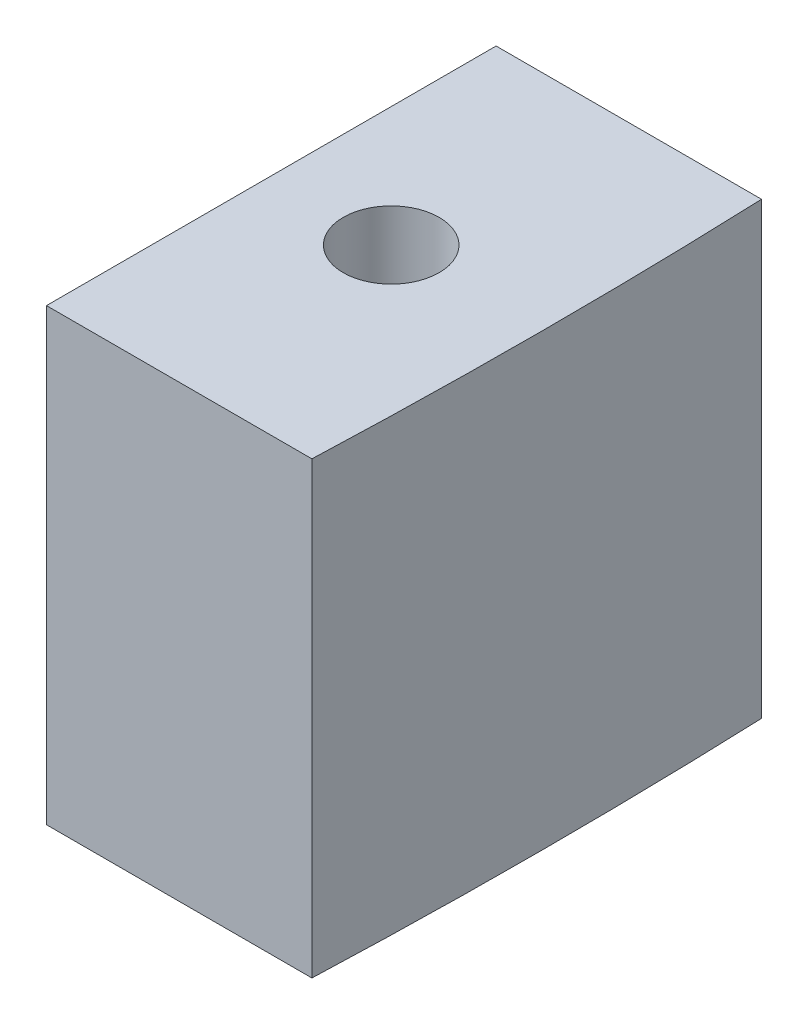
ISO-10303-21;
HEADER;
FILE_DESCRIPTION(('STEP AP214'),'2;1');
FILE_NAME('part.step','',(''),(''),'','','');
FILE_SCHEMA(('AUTOMOTIVE_DESIGN { 1 0 10303 214 1 1 1 1 }'));
ENDSEC;
DATA;
#1=APPLICATION_CONTEXT('core data for automotive mechanical design processes');
#2=APPLICATION_PROTOCOL_DEFINITION('international standard','automotive_design',2000,#1);
#3=PRODUCT_CONTEXT('',#1,'mechanical');
#4=PRODUCT('Part','Part','',(#3));
#5=PRODUCT_RELATED_PRODUCT_CATEGORY('part','',(#4));
#6=PRODUCT_DEFINITION_FORMATION('','',#4);
#7=PRODUCT_DEFINITION_CONTEXT('part definition',#1,'design');
#8=PRODUCT_DEFINITION('design','',#6,#7);
#9=PRODUCT_DEFINITION_SHAPE('','',#8);
#10=(LENGTH_UNIT() NAMED_UNIT(*) SI_UNIT(.MILLI.,.METRE.));
#11=(NAMED_UNIT(*) PLANE_ANGLE_UNIT() SI_UNIT($,.RADIAN.));
#12=(NAMED_UNIT(*) SI_UNIT($,.STERADIAN.) SOLID_ANGLE_UNIT());
#13=UNCERTAINTY_MEASURE_WITH_UNIT(LENGTH_MEASURE(1.E-05),#10,'distance_accuracy_value','');
#14=(GEOMETRIC_REPRESENTATION_CONTEXT(3) GLOBAL_UNCERTAINTY_ASSIGNED_CONTEXT((#13)) GLOBAL_UNIT_ASSIGNED_CONTEXT((#10,
#11,#12)) REPRESENTATION_CONTEXT('',''));
#15=CARTESIAN_POINT('',(0.,0.,0.));
#16=DIRECTION('',(0.,0.,1.));
#17=DIRECTION('',(1.,0.,0.));
#18=AXIS2_PLACEMENT_3D('',#15,#16,#17);
#19=CARTESIAN_POINT('',(-29.4485422847458,0.,0.));
#20=DIRECTION('',(0.,-1.,0.));
#21=DIRECTION('',(0.,0.,-1.));
#22=AXIS2_PLACEMENT_3D('',#19,#20,#21);
#23=CYLINDRICAL_SURFACE('',#22,1.59999999999999);
#24=CARTESIAN_POINT('',(-29.4485422847458,15.,0.));
#25=DIRECTION('',(0.,1.,0.));
#26=DIRECTION('',(0.,0.,1.));
#27=AXIS2_PLACEMENT_3D('',#24,#25,#26);
#28=CIRCLE('',#27,1.59999999999999);
#29=CARTESIAN_POINT('',(-29.4485422847458,15.,1.59999999999999));
#30=VERTEX_POINT('',#29);
#31=EDGE_CURVE('E166',#30,#30,#28,.T.);
#32=ORIENTED_EDGE('',*,*,#31,.T.);
#33=EDGE_LOOP('',(#32));
#34=FACE_BOUND('',#33,.T.);
#35=CARTESIAN_POINT('',(-29.4485422847458,4.,0.));
#36=DIRECTION('',(0.,-1.,0.));
#37=DIRECTION('',(0.,0.,-1.));
#38=AXIS2_PLACEMENT_3D('',#35,#36,#37);
#39=CIRCLE('',#38,1.59999999999999);
#40=CARTESIAN_POINT('',(-29.4485422847458,4.,-1.59999999999999));
#41=VERTEX_POINT('',#40);
#42=EDGE_CURVE('E37',#41,#41,#39,.F.);
#43=ORIENTED_EDGE('',*,*,#42,.F.);
#44=EDGE_LOOP('',(#43));
#45=FACE_BOUND('',#44,.T.);
#46=ADVANCED_FACE('F33',(#34,#45),#23,.F.);
#47=CARTESIAN_POINT('',(0.,0.,0.));
#48=DIRECTION('',(0.,1.,0.));
#49=DIRECTION('',(0.,0.,1.));
#50=AXIS2_PLACEMENT_3D('',#47,#48,#49);
#51=PLANE('',#50);
#52=DIRECTION('',(0.866025403784439,0.,0.5));
#53=VECTOR('',#52,1.);
#54=CARTESIAN_POINT('',(-29.4485422847458,0.,-3.2331615074619));
#55=LINE('',#54,#53);
#56=CARTESIAN_POINT('',(-29.4485422847458,0.,-3.2331615074619));
#57=VERTEX_POINT('',#56);
#58=CARTESIAN_POINT('',(-26.6485422847458,0.,-1.61658075373095));
#59=VERTEX_POINT('',#58);
#60=EDGE_CURVE('E147',#57,#59,#55,.T.);
#61=ORIENTED_EDGE('',*,*,#60,.F.);
#62=DIRECTION('',(0.866025403784439,0.,-0.5));
#63=VECTOR('',#62,1.);
#64=CARTESIAN_POINT('',(-32.2485422847457,0.,-1.61658075373095));
#65=LINE('',#64,#63);
#66=CARTESIAN_POINT('',(-32.2485422847457,0.,-1.61658075373095));
#67=VERTEX_POINT('',#66);
#68=EDGE_CURVE('E49',#67,#57,#65,.T.);
#69=ORIENTED_EDGE('',*,*,#68,.F.);
#70=DIRECTION('',(0.,0.,-1.));
#71=VECTOR('',#70,1.);
#72=CARTESIAN_POINT('',(-32.2485422847457,0.,1.61658075373095));
#73=LINE('',#72,#71);
#74=CARTESIAN_POINT('',(-32.2485422847457,0.,1.61658075373095));
#75=VERTEX_POINT('',#74);
#76=EDGE_CURVE('E133',#75,#67,#73,.T.);
#77=ORIENTED_EDGE('',*,*,#76,.F.);
#78=DIRECTION('',(-0.866025403784439,0.,-0.5));
#79=VECTOR('',#78,1.);
#80=CARTESIAN_POINT('',(-29.4485422847458,0.,3.23316150746189));
#81=LINE('',#80,#79);
#82=CARTESIAN_POINT('',(-29.4485422847458,0.,3.23316150746189));
#83=VERTEX_POINT('',#82);
#84=EDGE_CURVE('E136',#83,#75,#81,.T.);
#85=ORIENTED_EDGE('',*,*,#84,.F.);
#86=DIRECTION('',(-0.866025403784438,0.,0.5));
#87=VECTOR('',#86,1.);
#88=CARTESIAN_POINT('',(-26.6485422847458,0.,1.61658075373095));
#89=LINE('',#88,#87);
#90=CARTESIAN_POINT('',(-26.6485422847458,0.,1.61658075373095));
#91=VERTEX_POINT('',#90);
#92=EDGE_CURVE('E152',#91,#83,#89,.T.);
#93=ORIENTED_EDGE('',*,*,#92,.F.);
#94=DIRECTION('',(0.,0.,1.));
#95=VECTOR('',#94,1.);
#96=CARTESIAN_POINT('',(-26.6485422847458,0.,-1.61658075373095));
#97=LINE('',#96,#95);
#98=EDGE_CURVE('E149',#59,#91,#97,.T.);
#99=ORIENTED_EDGE('',*,*,#98,.F.);
#100=EDGE_LOOP('',(#61,#69,#77,#85,#93,#99));
#101=FACE_BOUND('',#100,.T.);
#102=DIRECTION('',(-1.,0.,0.));
#103=VECTOR('',#102,1.);
#104=CARTESIAN_POINT('',(-33.4485422847458,0.,-7.5));
#105=LINE('',#104,#103);
#106=CARTESIAN_POINT('',(-24.5935707209501,0.,-7.5));
#107=VERTEX_POINT('',#106);
#108=CARTESIAN_POINT('',(-33.4485422847458,0.,-7.5));
#109=VERTEX_POINT('',#108);
#110=EDGE_CURVE('E176',#107,#109,#105,.T.);
#111=ORIENTED_EDGE('',*,*,#110,.F.);
#112=CARTESIAN_POINT('',(-218.448542284746,0.,0.));
#113=DIRECTION('',(0.,1.,0.));
#114=DIRECTION('',(0.,0.,-1.));
#115=AXIS2_PLACEMENT_3D('',#112,#113,#114);
#116=CIRCLE('',#115,194.);
#117=CARTESIAN_POINT('',(-24.5935707209501,0.,7.5));
#118=VERTEX_POINT('',#117);
#119=EDGE_CURVE('E172',#118,#107,#116,.T.);
#120=ORIENTED_EDGE('',*,*,#119,.F.);
#121=DIRECTION('',(1.,0.,0.));
#122=VECTOR('',#121,1.);
#123=CARTESIAN_POINT('',(-33.4485422847458,0.,7.5));
#124=LINE('',#123,#122);
#125=CARTESIAN_POINT('',(-33.4485422847458,0.,7.5));
#126=VERTEX_POINT('',#125);
#127=EDGE_CURVE('E182',#126,#118,#124,.T.);
#128=ORIENTED_EDGE('',*,*,#127,.F.);
#129=DIRECTION('',(0.,0.,1.));
#130=VECTOR('',#129,1.);
#131=CARTESIAN_POINT('',(-33.4485422847458,0.,-7.5));
#132=LINE('',#131,#130);
#133=EDGE_CURVE('E188',#109,#126,#132,.T.);
#134=ORIENTED_EDGE('',*,*,#133,.F.);
#135=EDGE_LOOP('',(#111,#120,#128,#134));
#136=FACE_BOUND('',#135,.T.);
#137=ADVANCED_FACE('F203',(#101,#136),#51,.F.);
#138=CARTESIAN_POINT('',(-33.4485422847458,15.,-7.5));
#139=DIRECTION('',(0.,0.,1.));
#140=DIRECTION('',(1.,0.,0.));
#141=AXIS2_PLACEMENT_3D('',#138,#139,#140);
#142=PLANE('',#141);
#143=DIRECTION('',(-1.,0.,0.));
#144=VECTOR('',#143,1.);
#145=CARTESIAN_POINT('',(-33.4485422847458,15.,-7.5));
#146=LINE('',#145,#144);
#147=CARTESIAN_POINT('',(-24.5935707209501,15.,-7.5));
#148=VERTEX_POINT('',#147);
#149=CARTESIAN_POINT('',(-33.4485422847458,15.,-7.5));
#150=VERTEX_POINT('',#149);
#151=EDGE_CURVE('E179',#148,#150,#146,.T.);
#152=ORIENTED_EDGE('',*,*,#151,.F.);
#153=DIRECTION('',(0.,-1.,0.));
#154=VECTOR('',#153,1.);
#155=CARTESIAN_POINT('',(-24.5935707209501,15.001,-7.5));
#156=LINE('',#155,#154);
#157=EDGE_CURVE('E174',#148,#107,#156,.T.);
#158=ORIENTED_EDGE('',*,*,#157,.T.);
#159=ORIENTED_EDGE('',*,*,#110,.T.);
#160=DIRECTION('',(0.,-1.,0.));
#161=VECTOR('',#160,1.);
#162=CARTESIAN_POINT('',(-33.4485422847458,15.,-7.5));
#163=LINE('',#162,#161);
#164=EDGE_CURVE('E11',#150,#109,#163,.T.);
#165=ORIENTED_EDGE('',*,*,#164,.F.);
#166=EDGE_LOOP('',(#152,#158,#159,#165));
#167=FACE_BOUND('',#166,.T.);
#168=ADVANCED_FACE('F35',(#167),#142,.F.);
#169=CARTESIAN_POINT('',(-33.4485422847458,15.,-7.5));
#170=DIRECTION('',(1.,0.,0.));
#171=DIRECTION('',(0.,0.,-1.));
#172=AXIS2_PLACEMENT_3D('',#169,#170,#171);
#173=PLANE('',#172);
#174=ORIENTED_EDGE('',*,*,#133,.T.);
#175=DIRECTION('',(0.,-1.,0.));
#176=VECTOR('',#175,1.);
#177=CARTESIAN_POINT('',(-33.4485422847458,15.,7.5));
#178=LINE('',#177,#176);
#179=CARTESIAN_POINT('',(-33.4485422847458,15.,7.5));
#180=VERTEX_POINT('',#179);
#181=EDGE_CURVE('E42',#180,#126,#178,.T.);
#182=ORIENTED_EDGE('',*,*,#181,.F.);
#183=DIRECTION('',(0.,0.,1.));
#184=VECTOR('',#183,1.);
#185=CARTESIAN_POINT('',(-33.4485422847458,15.,-7.5));
#186=LINE('',#185,#184);
#187=EDGE_CURVE('E181',#150,#180,#186,.T.);
#188=ORIENTED_EDGE('',*,*,#187,.F.);
#189=ORIENTED_EDGE('',*,*,#164,.T.);
#190=EDGE_LOOP('',(#174,#182,#188,#189));
#191=FACE_BOUND('',#190,.T.);
#192=ADVANCED_FACE('F210',(#191),#173,.F.);
#193=CARTESIAN_POINT('',(-33.4485422847458,15.,7.5));
#194=DIRECTION('',(0.,0.,-1.));
#195=DIRECTION('',(-1.,0.,0.));
#196=AXIS2_PLACEMENT_3D('',#193,#194,#195);
#197=PLANE('',#196);
#198=ORIENTED_EDGE('',*,*,#127,.T.);
#199=DIRECTION('',(0.,-1.,0.));
#200=VECTOR('',#199,1.);
#201=CARTESIAN_POINT('',(-24.5935707209501,15.001,7.5));
#202=LINE('',#201,#200);
#203=CARTESIAN_POINT('',(-24.5935707209501,15.,7.5));
#204=VERTEX_POINT('',#203);
#205=EDGE_CURVE('E57',#204,#118,#202,.T.);
#206=ORIENTED_EDGE('',*,*,#205,.F.);
#207=DIRECTION('',(1.,0.,0.));
#208=VECTOR('',#207,1.);
#209=CARTESIAN_POINT('',(-33.4485422847458,15.,7.5));
#210=LINE('',#209,#208);
#211=EDGE_CURVE('E184',#180,#204,#210,.T.);
#212=ORIENTED_EDGE('',*,*,#211,.F.);
#213=ORIENTED_EDGE('',*,*,#181,.T.);
#214=EDGE_LOOP('',(#198,#206,#212,#213));
#215=FACE_BOUND('',#214,.T.);
#216=ADVANCED_FACE('F197',(#215),#197,.F.);
#217=CARTESIAN_POINT('',(0.,15.,0.));
#218=DIRECTION('',(0.,1.,0.));
#219=DIRECTION('',(0.,0.,1.));
#220=AXIS2_PLACEMENT_3D('',#217,#218,#219);
#221=PLANE('',#220);
#222=ORIENTED_EDGE('',*,*,#31,.F.);
#223=EDGE_LOOP('',(#222));
#224=FACE_BOUND('',#223,.T.);
#225=CARTESIAN_POINT('',(-218.448542284746,15.,0.));
#226=DIRECTION('',(0.,1.,0.));
#227=DIRECTION('',(0.,0.,1.));
#228=AXIS2_PLACEMENT_3D('',#225,#226,#227);
#229=CIRCLE('',#228,194.);
#230=EDGE_CURVE('E169',#204,#148,#229,.T.);
#231=ORIENTED_EDGE('',*,*,#230,.T.);
#232=ORIENTED_EDGE('',*,*,#151,.T.);
#233=ORIENTED_EDGE('',*,*,#187,.T.);
#234=ORIENTED_EDGE('',*,*,#211,.T.);
#235=EDGE_LOOP('',(#231,#232,#233,#234));
#236=FACE_BOUND('',#235,.T.);
#237=ADVANCED_FACE('F209',(#224,#236),#221,.T.);
#238=CARTESIAN_POINT('',(-218.448542284746,15.001,0.));
#239=DIRECTION('',(0.,-1.,0.));
#240=DIRECTION('',(0.,0.,-1.));
#241=AXIS2_PLACEMENT_3D('',#238,#239,#240);
#242=CYLINDRICAL_SURFACE('',#241,194.);
#243=ORIENTED_EDGE('',*,*,#205,.T.);
#244=ORIENTED_EDGE('',*,*,#119,.T.);
#245=ORIENTED_EDGE('',*,*,#157,.F.);
#246=ORIENTED_EDGE('',*,*,#230,.F.);
#247=EDGE_LOOP('',(#243,#244,#245,#246));
#248=FACE_BOUND('',#247,.T.);
#249=ADVANCED_FACE('F204',(#248),#242,.T.);
#250=CARTESIAN_POINT('',(0.,4.,0.));
#251=DIRECTION('',(0.,-1.,0.));
#252=DIRECTION('',(0.,0.,-1.));
#253=AXIS2_PLACEMENT_3D('',#250,#251,#252);
#254=PLANE('',#253);
#255=DIRECTION('',(0.866025403784439,0.,-0.5));
#256=VECTOR('',#255,1.);
#257=CARTESIAN_POINT('',(-32.2485422847457,4.,-1.61658075373095));
#258=LINE('',#257,#256);
#259=CARTESIAN_POINT('',(-32.2485422847457,4.,-1.61658075373095));
#260=VERTEX_POINT('',#259);
#261=CARTESIAN_POINT('',(-29.4485422847458,4.,-3.2331615074619));
#262=VERTEX_POINT('',#261);
#263=EDGE_CURVE('E113',#260,#262,#258,.T.);
#264=ORIENTED_EDGE('',*,*,#263,.T.);
#265=DIRECTION('',(0.866025403784439,0.,0.5));
#266=VECTOR('',#265,1.);
#267=CARTESIAN_POINT('',(-29.4485422847458,4.,-3.2331615074619));
#268=LINE('',#267,#266);
#269=CARTESIAN_POINT('',(-26.6485422847458,4.,-1.61658075373095));
#270=VERTEX_POINT('',#269);
#271=EDGE_CURVE('E122',#262,#270,#268,.T.);
#272=ORIENTED_EDGE('',*,*,#271,.T.);
#273=DIRECTION('',(0.,0.,1.));
#274=VECTOR('',#273,1.);
#275=CARTESIAN_POINT('',(-26.6485422847458,4.,-1.61658075373095));
#276=LINE('',#275,#274);
#277=CARTESIAN_POINT('',(-26.6485422847458,4.,1.61658075373095));
#278=VERTEX_POINT('',#277);
#279=EDGE_CURVE('E127',#270,#278,#276,.T.);
#280=ORIENTED_EDGE('',*,*,#279,.T.);
#281=DIRECTION('',(-0.866025403784438,0.,0.5));
#282=VECTOR('',#281,1.);
#283=CARTESIAN_POINT('',(-26.6485422847458,4.,1.61658075373095));
#284=LINE('',#283,#282);
#285=CARTESIAN_POINT('',(-29.4485422847458,4.,3.23316150746189));
#286=VERTEX_POINT('',#285);
#287=EDGE_CURVE('E140',#278,#286,#284,.T.);
#288=ORIENTED_EDGE('',*,*,#287,.T.);
#289=DIRECTION('',(-0.866025403784439,0.,-0.5));
#290=VECTOR('',#289,1.);
#291=CARTESIAN_POINT('',(-29.4485422847458,4.,3.23316150746189));
#292=LINE('',#291,#290);
#293=CARTESIAN_POINT('',(-32.2485422847457,4.,1.61658075373095));
#294=VERTEX_POINT('',#293);
#295=EDGE_CURVE('E143',#286,#294,#292,.T.);
#296=ORIENTED_EDGE('',*,*,#295,.T.);
#297=DIRECTION('',(0.,0.,-1.));
#298=VECTOR('',#297,1.);
#299=CARTESIAN_POINT('',(-32.2485422847457,4.,1.61658075373095));
#300=LINE('',#299,#298);
#301=EDGE_CURVE('E119',#294,#260,#300,.T.);
#302=ORIENTED_EDGE('',*,*,#301,.T.);
#303=EDGE_LOOP('',(#264,#272,#280,#288,#296,#302));
#304=FACE_BOUND('',#303,.T.);
#305=ORIENTED_EDGE('',*,*,#42,.T.);
#306=EDGE_LOOP('',(#305));
#307=FACE_BOUND('',#306,.T.);
#308=ADVANCED_FACE('F129',(#304,#307),#254,.T.);
#309=CARTESIAN_POINT('',(-32.2485422847457,4.,-1.61658075373095));
#310=DIRECTION('',(-0.5,0.,-0.866025403784439));
#311=DIRECTION('',(-0.866025403784439,0.,0.5));
#312=AXIS2_PLACEMENT_3D('',#309,#310,#311);
#313=PLANE('',#312);
#314=ORIENTED_EDGE('',*,*,#68,.T.);
#315=DIRECTION('',(0.,-1.,0.));
#316=VECTOR('',#315,1.);
#317=CARTESIAN_POINT('',(-29.4485422847458,4.,-3.2331615074619));
#318=LINE('',#317,#316);
#319=EDGE_CURVE('E109',#262,#57,#318,.T.);
#320=ORIENTED_EDGE('',*,*,#319,.F.);
#321=ORIENTED_EDGE('',*,*,#263,.F.);
#322=DIRECTION('',(0.,-1.,0.));
#323=VECTOR('',#322,1.);
#324=CARTESIAN_POINT('',(-32.2485422847457,4.,-1.61658075373095));
#325=LINE('',#324,#323);
#326=EDGE_CURVE('E157',#260,#67,#325,.T.);
#327=ORIENTED_EDGE('',*,*,#326,.T.);
#328=EDGE_LOOP('',(#314,#320,#321,#327));
#329=FACE_BOUND('',#328,.T.);
#330=ADVANCED_FACE('F111',(#329),#313,.F.);
#331=CARTESIAN_POINT('',(-32.2485422847457,4.,1.61658075373095));
#332=DIRECTION('',(-1.,0.,0.));
#333=DIRECTION('',(0.,0.,1.));
#334=AXIS2_PLACEMENT_3D('',#331,#332,#333);
#335=PLANE('',#334);
#336=ORIENTED_EDGE('',*,*,#76,.T.);
#337=ORIENTED_EDGE('',*,*,#326,.F.);
#338=ORIENTED_EDGE('',*,*,#301,.F.);
#339=DIRECTION('',(0.,-1.,0.));
#340=VECTOR('',#339,1.);
#341=CARTESIAN_POINT('',(-32.2485422847457,4.,1.61658075373095));
#342=LINE('',#341,#340);
#343=EDGE_CURVE('E159',#294,#75,#342,.T.);
#344=ORIENTED_EDGE('',*,*,#343,.T.);
#345=EDGE_LOOP('',(#336,#337,#338,#344));
#346=FACE_BOUND('',#345,.T.);
#347=ADVANCED_FACE('F265',(#346),#335,.F.);
#348=CARTESIAN_POINT('',(-29.4485422847458,4.,3.23316150746189));
#349=DIRECTION('',(-0.5,0.,0.866025403784439));
#350=DIRECTION('',(0.866025403784439,0.,0.5));
#351=AXIS2_PLACEMENT_3D('',#348,#349,#350);
#352=PLANE('',#351);
#353=ORIENTED_EDGE('',*,*,#84,.T.);
#354=ORIENTED_EDGE('',*,*,#343,.F.);
#355=ORIENTED_EDGE('',*,*,#295,.F.);
#356=DIRECTION('',(0.,-1.,0.));
#357=VECTOR('',#356,1.);
#358=CARTESIAN_POINT('',(-29.4485422847458,4.,3.23316150746189));
#359=LINE('',#358,#357);
#360=EDGE_CURVE('E161',#286,#83,#359,.T.);
#361=ORIENTED_EDGE('',*,*,#360,.T.);
#362=EDGE_LOOP('',(#353,#354,#355,#361));
#363=FACE_BOUND('',#362,.T.);
#364=ADVANCED_FACE('F273',(#363),#352,.F.);
#365=CARTESIAN_POINT('',(-26.6485422847458,4.,1.61658075373095));
#366=DIRECTION('',(0.5,0.,0.866025403784439));
#367=DIRECTION('',(0.866025403784439,0.,-0.5));
#368=AXIS2_PLACEMENT_3D('',#365,#366,#367);
#369=PLANE('',#368);
#370=ORIENTED_EDGE('',*,*,#92,.T.);
#371=ORIENTED_EDGE('',*,*,#360,.F.);
#372=ORIENTED_EDGE('',*,*,#287,.F.);
#373=DIRECTION('',(0.,-1.,0.));
#374=VECTOR('',#373,1.);
#375=CARTESIAN_POINT('',(-26.6485422847458,4.,1.61658075373095));
#376=LINE('',#375,#374);
#377=EDGE_CURVE('E163',#278,#91,#376,.T.);
#378=ORIENTED_EDGE('',*,*,#377,.T.);
#379=EDGE_LOOP('',(#370,#371,#372,#378));
#380=FACE_BOUND('',#379,.T.);
#381=ADVANCED_FACE('F283',(#380),#369,.F.);
#382=CARTESIAN_POINT('',(-26.6485422847458,4.,-1.61658075373095));
#383=DIRECTION('',(1.,0.,0.));
#384=DIRECTION('',(0.,0.,-1.));
#385=AXIS2_PLACEMENT_3D('',#382,#383,#384);
#386=PLANE('',#385);
#387=ORIENTED_EDGE('',*,*,#98,.T.);
#388=ORIENTED_EDGE('',*,*,#377,.F.);
#389=ORIENTED_EDGE('',*,*,#279,.F.);
#390=DIRECTION('',(0.,-1.,0.));
#391=VECTOR('',#390,1.);
#392=CARTESIAN_POINT('',(-26.6485422847458,4.,-1.61658075373095));
#393=LINE('',#392,#391);
#394=EDGE_CURVE('E118',#270,#59,#393,.T.);
#395=ORIENTED_EDGE('',*,*,#394,.T.);
#396=EDGE_LOOP('',(#387,#388,#389,#395));
#397=FACE_BOUND('',#396,.T.);
#398=ADVANCED_FACE('F293',(#397),#386,.F.);
#399=CARTESIAN_POINT('',(-29.4485422847458,4.,-3.2331615074619));
#400=DIRECTION('',(0.5,0.,-0.866025403784439));
#401=DIRECTION('',(-0.866025403784439,0.,-0.5));
#402=AXIS2_PLACEMENT_3D('',#399,#400,#401);
#403=PLANE('',#402);
#404=ORIENTED_EDGE('',*,*,#60,.T.);
#405=ORIENTED_EDGE('',*,*,#394,.F.);
#406=ORIENTED_EDGE('',*,*,#271,.F.);
#407=ORIENTED_EDGE('',*,*,#319,.T.);
#408=EDGE_LOOP('',(#404,#405,#406,#407));
#409=FACE_BOUND('',#408,.T.);
#410=ADVANCED_FACE('F123',(#409),#403,.F.);
#411=CLOSED_SHELL('',(#46,#137,#168,#192,#216,#237,#249,#308,#330,#347,#364,#381,#398,#410));
#412=MANIFOLD_SOLID_BREP('B2',#411);
#413=ADVANCED_BREP_SHAPE_REPRESENTATION('',(#18,#412),#14);
#414=SHAPE_DEFINITION_REPRESENTATION(#9,#413);
ENDSEC;
END-ISO-10303-21;
